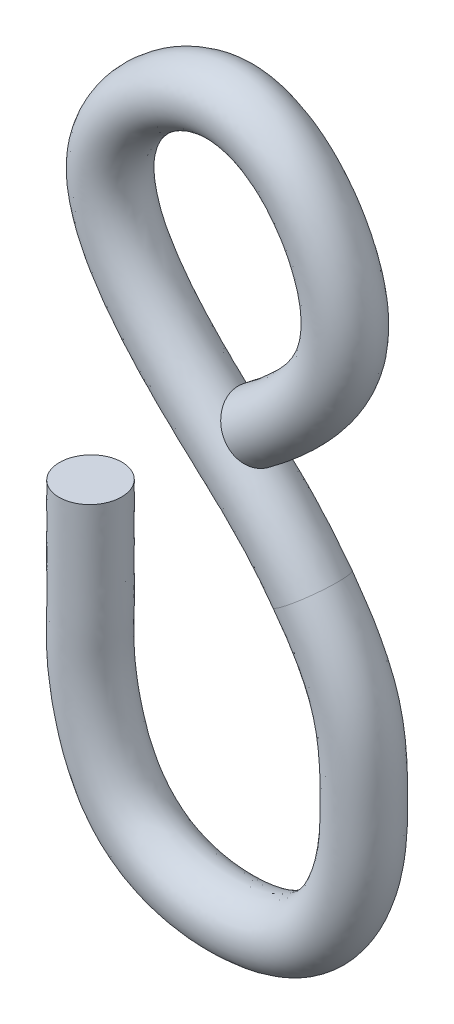
ISO-10303-21;
HEADER;
FILE_DESCRIPTION(('STEP AP214'),'2;1');
FILE_NAME('part.step','',(''),(''),'','','');
FILE_SCHEMA(('AUTOMOTIVE_DESIGN { 1 0 10303 214 1 1 1 1 }'));
ENDSEC;
DATA;
#1=APPLICATION_CONTEXT('core data for automotive mechanical design processes');
#2=APPLICATION_PROTOCOL_DEFINITION('international standard','automotive_design',2000,#1);
#3=PRODUCT_CONTEXT('',#1,'mechanical');
#4=PRODUCT('Part','Part','',(#3));
#5=PRODUCT_RELATED_PRODUCT_CATEGORY('part','',(#4));
#6=PRODUCT_DEFINITION_FORMATION('','',#4);
#7=PRODUCT_DEFINITION_CONTEXT('part definition',#1,'design');
#8=PRODUCT_DEFINITION('design','',#6,#7);
#9=PRODUCT_DEFINITION_SHAPE('','',#8);
#10=(LENGTH_UNIT() NAMED_UNIT(*) SI_UNIT(.MILLI.,.METRE.));
#11=(NAMED_UNIT(*) PLANE_ANGLE_UNIT() SI_UNIT($,.RADIAN.));
#12=(NAMED_UNIT(*) SI_UNIT($,.STERADIAN.) SOLID_ANGLE_UNIT());
#13=UNCERTAINTY_MEASURE_WITH_UNIT(LENGTH_MEASURE(1.E-05),#10,'distance_accuracy_value','');
#14=(GEOMETRIC_REPRESENTATION_CONTEXT(3) GLOBAL_UNCERTAINTY_ASSIGNED_CONTEXT((#13)) GLOBAL_UNIT_ASSIGNED_CONTEXT((#10,
#11,#12)) REPRESENTATION_CONTEXT('',''));
#15=CARTESIAN_POINT('',(0.,0.,0.));
#16=DIRECTION('',(0.,0.,1.));
#17=DIRECTION('',(1.,0.,0.));
#18=AXIS2_PLACEMENT_3D('',#15,#16,#17);
#19=CARTESIAN_POINT('',(-19.05,-6.4168863140052,0.));
#20=DIRECTION('',(0.0164387828036416,-0.99986487408046,0.));
#21=DIRECTION('',(0.99986487408046,0.0164387828036416,0.));
#22=AXIS2_PLACEMENT_3D('',#19,#20,#21);
#23=PLANE('',#22);
#24=CARTESIAN_POINT('',(-19.05,-6.4168863140052,0.));
#25=DIRECTION('',(0.0164387828036416,-0.99986487408046,0.));
#26=DIRECTION('',(0.99986487408046,0.0164387828036416,0.));
#27=AXIS2_PLACEMENT_3D('',#24,#25,#26);
#28=CIRCLE('',#27,4.318);
#29=CARTESIAN_POINT('',(-14.7325834737206,-6.34590364985908,0.));
#30=VERTEX_POINT('',#29);
#31=EDGE_CURVE('E39',#30,#30,#28,.T.);
#32=ORIENTED_EDGE('',*,*,#31,.F.);
#33=EDGE_LOOP('',(#32));
#34=FACE_BOUND('',#33,.T.);
#35=ADVANCED_FACE('F36',(#34),#23,.F.);
#36=CARTESIAN_POINT('',(4.11496441653096,11.733169569429,0.));
#37=DIRECTION('',(-0.802534746488182,-0.596605381034356,0.));
#38=DIRECTION('',(0.596605381034356,-0.802534746488182,0.));
#39=AXIS2_PLACEMENT_3D('',#36,#37,#38);
#40=PLANE('',#39);
#41=CARTESIAN_POINT('',(4.11496441653096,11.733169569429,0.));
#42=DIRECTION('',(0.802534746488182,0.596605381034356,0.));
#43=DIRECTION('',(-0.596605381034356,0.802534746488182,0.));
#44=AXIS2_PLACEMENT_3D('',#41,#42,#43);
#45=CIRCLE('',#44,4.318);
#46=CARTESIAN_POINT('',(6.69110645183731,8.26782453409303,0.));
#47=VERTEX_POINT('',#46);
#48=EDGE_CURVE('E44',#47,#47,#45,.T.);
#49=ORIENTED_EDGE('',*,*,#48,.F.);
#50=EDGE_LOOP('',(#49));
#51=FACE_BOUND('',#50,.T.);
#52=ADVANCED_FACE('F70',(#51),#40,.T.);
#53=CARTESIAN_POINT('',(-14.7325834737206,-6.34590364985908,0.));
#54=CARTESIAN_POINT('',(-14.7254328229671,-6.7808319109972,0.));
#55=CARTESIAN_POINT('',(-14.7241074750267,-7.36549660511291,0.));
#56=CARTESIAN_POINT('',(-14.7252174364728,-8.82670726336239,0.));
#57=CARTESIAN_POINT('',(-14.7280481883105,-9.6937262817303,0.));
#58=CARTESIAN_POINT('',(-14.7367607263986,-12.5357255528229,0.));
#59=CARTESIAN_POINT('',(-14.7428400001958,-14.7518943416169,0.));
#60=CARTESIAN_POINT('',(-14.7270109123728,-17.7590349666467,0.));
#61=CARTESIAN_POINT('',(-14.7180873834829,-18.7001309211865,0.));
#62=CARTESIAN_POINT('',(-14.714141920567,-20.5999160815396,0.));
#63=CARTESIAN_POINT('',(-14.7209877801932,-21.5797898323224,0.));
#64=CARTESIAN_POINT('',(-14.7642585356283,-23.501527991146,0.));
#65=CARTESIAN_POINT('',(-14.7914044263805,-24.4062928172492,0.));
#66=CARTESIAN_POINT('',(-14.7779135963209,-26.2028860802022,0.));
#67=CARTESIAN_POINT('',(-14.7359883656067,-27.0938937894571,0.));
#68=CARTESIAN_POINT('',(-14.428294224436,-30.0208629181334,0.));
#69=CARTESIAN_POINT('',(-13.9942212221248,-32.2002118994148,0.));
#70=CARTESIAN_POINT('',(-12.7077764510078,-36.2389952223302,0.));
#71=CARTESIAN_POINT('',(-11.8441888216928,-38.0967105677315,0.));
#72=CARTESIAN_POINT('',(-10.1511386282284,-40.5173502817308,0.));
#73=CARTESIAN_POINT('',(-9.2818207492585,-41.3766293788584,0.));
#74=CARTESIAN_POINT('',(-7.34235762378109,-42.7824918273544,0.));
#75=CARTESIAN_POINT('',(-6.26756808146904,-43.3266938108804,0.));
#76=CARTESIAN_POINT('',(-2.79424963911756,-44.5386102689522,0.));
#77=CARTESIAN_POINT('',(-0.132856514965718,-44.7595620401585,0.));
#78=CARTESIAN_POINT('',(4.27362198728435,-44.354725550921,0.));
#79=CARTESIAN_POINT('',(5.94231889001343,-43.9145643221827,0.));
#80=CARTESIAN_POINT('',(8.76228712345711,-42.5384016023766,0.));
#81=CARTESIAN_POINT('',(9.9378326974876,-41.6164377140105,0.));
#82=CARTESIAN_POINT('',(12.2150705755318,-38.7133734545041,0.));
#83=CARTESIAN_POINT('',(13.3162869229431,-36.4363567667052,0.));
#84=CARTESIAN_POINT('',(14.2788780980703,-32.745220886058,0.));
#85=CARTESIAN_POINT('',(14.480419538483,-31.4991228328472,0.));
#86=CARTESIAN_POINT('',(14.7056328289962,-28.8167545832706,0.));
#87=CARTESIAN_POINT('',(14.7324396692236,-27.393892951395,0.));
#88=CARTESIAN_POINT('',(14.7311674040191,-23.1105977273629,0.));
#89=CARTESIAN_POINT('',(14.62629555945,-20.5267499394289,0.));
#90=CARTESIAN_POINT('',(13.9820226516246,-17.1515978595451,0.));
#91=CARTESIAN_POINT('',(13.6886558039231,-16.1203405285045,0.));
#92=CARTESIAN_POINT('',(12.8834695158917,-14.0056647434885,0.));
#93=CARTESIAN_POINT('',(12.3789758548303,-12.9418790853601,0.));
#94=CARTESIAN_POINT('',(10.8424179460945,-10.1581617973899,0.));
#95=CARTESIAN_POINT('',(9.6746553102802,-8.4165338483334,0.));
#96=CARTESIAN_POINT('',(8.42173674603075,-6.72896085834348,0.));
#97=CARTESIAN_POINT('',(-14.7325834737206,-6.34590364985908,8.636));
#98=CARTESIAN_POINT('',(-14.7254328229671,-6.7808319109972,8.636));
#99=CARTESIAN_POINT('',(-14.7241074750267,-7.36549660511291,8.636));
#100=CARTESIAN_POINT('',(-14.7252174364728,-8.82670726336239,8.636));
#101=CARTESIAN_POINT('',(-14.7280481883105,-9.6937262817303,8.636));
#102=CARTESIAN_POINT('',(-14.7367607263986,-12.5357255528229,8.636));
#103=CARTESIAN_POINT('',(-14.7428400001958,-14.7518943416169,8.636));
#104=CARTESIAN_POINT('',(-14.7270109123728,-17.7590349666467,8.636));
#105=CARTESIAN_POINT('',(-14.7180873834829,-18.7001309211865,8.636));
#106=CARTESIAN_POINT('',(-14.714141920567,-20.5999160815396,8.636));
#107=CARTESIAN_POINT('',(-14.7209877801932,-21.5797898323224,8.636));
#108=CARTESIAN_POINT('',(-14.7642585356283,-23.501527991146,8.636));
#109=CARTESIAN_POINT('',(-14.7914044263805,-24.4062928172492,8.636));
#110=CARTESIAN_POINT('',(-14.7779135963209,-26.2028860802022,8.636));
#111=CARTESIAN_POINT('',(-14.7359883656067,-27.0938937894571,8.636));
#112=CARTESIAN_POINT('',(-14.428294224436,-30.0208629181334,8.636));
#113=CARTESIAN_POINT('',(-13.9942212221248,-32.2002118994148,8.636));
#114=CARTESIAN_POINT('',(-12.7077764510078,-36.2389952223302,8.636));
#115=CARTESIAN_POINT('',(-11.8441888216928,-38.0967105677315,8.636));
#116=CARTESIAN_POINT('',(-10.1511386282284,-40.5173502817308,8.636));
#117=CARTESIAN_POINT('',(-9.2818207492585,-41.3766293788584,8.636));
#118=CARTESIAN_POINT('',(-7.34235762378109,-42.7824918273544,8.636));
#119=CARTESIAN_POINT('',(-6.26756808146904,-43.3266938108804,8.636));
#120=CARTESIAN_POINT('',(-2.79424963911756,-44.5386102689522,8.636));
#121=CARTESIAN_POINT('',(-0.132856514965718,-44.7595620401585,8.636));
#122=CARTESIAN_POINT('',(4.27362198728435,-44.354725550921,8.636));
#123=CARTESIAN_POINT('',(5.94231889001343,-43.9145643221827,8.636));
#124=CARTESIAN_POINT('',(8.76228712345711,-42.5384016023766,8.636));
#125=CARTESIAN_POINT('',(9.9378326974876,-41.6164377140105,8.636));
#126=CARTESIAN_POINT('',(12.2150705755318,-38.7133734545041,8.636));
#127=CARTESIAN_POINT('',(13.3162869229431,-36.4363567667052,8.636));
#128=CARTESIAN_POINT('',(14.2788780980703,-32.745220886058,8.636));
#129=CARTESIAN_POINT('',(14.480419538483,-31.4991228328472,8.636));
#130=CARTESIAN_POINT('',(14.7056328289962,-28.8167545832706,8.636));
#131=CARTESIAN_POINT('',(14.7324396692236,-27.393892951395,8.636));
#132=CARTESIAN_POINT('',(14.7311674040191,-23.1105977273629,8.636));
#133=CARTESIAN_POINT('',(14.62629555945,-20.5267499394289,8.636));
#134=CARTESIAN_POINT('',(13.9820226516246,-17.1515978595451,8.636));
#135=CARTESIAN_POINT('',(13.6886558039231,-16.1203405285045,8.636));
#136=CARTESIAN_POINT('',(12.8834695158917,-14.0056647434885,8.636));
#137=CARTESIAN_POINT('',(12.3789758548303,-12.9418790853601,8.636));
#138=CARTESIAN_POINT('',(10.8424179460945,-10.1581617973899,8.636));
#139=CARTESIAN_POINT('',(9.6746553102802,-8.4165338483334,8.636));
#140=CARTESIAN_POINT('',(8.42173674603075,-6.72896085834347,8.636));
#141=CARTESIAN_POINT('',(-23.3674165262794,-6.48786897815133,8.636));
#142=CARTESIAN_POINT('',(-23.3622323899889,-6.80318626647926,8.636));
#143=CARTESIAN_POINT('',(-23.3601180643608,-7.37615694591977,8.636));
#144=CARTESIAN_POINT('',(-23.3612018640017,-8.80292680593947,8.636));
#145=CARTESIAN_POINT('',(-23.3640045459515,-9.66625290797423,8.636));
#146=CARTESIAN_POINT('',(-23.3727262685901,-12.511248148196,8.636));
#147=CARTESIAN_POINT('',(-23.3789817837576,-14.7476879967707,8.636));
#148=CARTESIAN_POINT('',(-23.3627688337695,-17.8277530740838,8.636));
#149=CARTESIAN_POINT('',(-23.3539797725524,-18.7609144133306,8.636));
#150=CARTESIAN_POINT('',(-23.3502122838888,-20.5750029114851,8.636));
#151=CARTESIAN_POINT('',(-23.3559036740191,-21.4344287958342,8.636));
#152=CARTESIAN_POINT('',(-23.3969659280282,-23.2580831056167,8.636));
#153=CARTESIAN_POINT('',(-23.42873878553,-24.2610182796444,8.636));
#154=CARTESIAN_POINT('',(-23.4120923011303,-26.477854416802,8.636));
#155=CARTESIAN_POINT('',(-23.3549745919598,-27.7084162950129,8.636));
#156=CARTESIAN_POINT('',(-22.9563426061567,-31.5004401324114,8.636));
#157=CARTESIAN_POINT('',(-22.4216901918861,-34.197054523551,8.636));
#158=CARTESIAN_POINT('',(-20.7376191561368,-39.4841823992839,8.636));
#159=CARTESIAN_POINT('',(-19.5994163949533,-42.0764149014211,8.636));
#160=CARTESIAN_POINT('',(-16.670374952904,-46.2642139702054,8.636));
#161=CARTESIAN_POINT('',(-15.0930938334186,-47.8304099102656,8.636));
#162=CARTESIAN_POINT('',(-11.6680147844855,-50.3131536949401,8.636));
#163=CARTESIAN_POINT('',(-9.82486114152734,-51.2320829038099,8.636));
#164=CARTESIAN_POINT('',(-4.21488165648385,-53.1895269414955,8.636));
#165=CARTESIAN_POINT('',(-0.381451635805625,-53.4547713746269,8.636));
#166=CARTESIAN_POINT('',(5.89750580893666,-52.8779045879972,8.636));
#167=CARTESIAN_POINT('',(8.62122772636509,-52.216706916149,8.636));
#168=CARTESIAN_POINT('',(13.6583587513814,-49.7585544239032,8.636));
#169=CARTESIAN_POINT('',(15.9474936216516,-47.9475620036466,8.636));
#170=CARTESIAN_POINT('',(19.9137526243296,-42.8913029086174,8.636));
#171=CARTESIAN_POINT('',(21.408836907548,-39.6278077216711,8.636));
#172=CARTESIAN_POINT('',(22.7673775228971,-34.4183707980143,8.636));
#173=CARTESIAN_POINT('',(23.0537740314502,-32.6071577559427,8.636));
#174=CARTESIAN_POINT('',(23.3437198353995,-29.1538028805282,8.636));
#175=CARTESIAN_POINT('',(23.3684686397601,-27.4901446784797,8.636));
#176=CARTESIAN_POINT('',(23.367111403686,-22.920780391519,8.636));
#177=CARTESIAN_POINT('',(23.2818743289537,-19.8124415539441,8.636));
#178=CARTESIAN_POINT('',(22.3784850755113,-15.0798568486278,8.636));
#179=CARTESIAN_POINT('',(21.9272666805951,-13.4881704181846,8.636));
#180=CARTESIAN_POINT('',(20.786357694246,-10.4917798380616,8.636));
#181=CARTESIAN_POINT('',(20.1016960911846,-9.06211887070707,8.636));
#182=CARTESIAN_POINT('',(18.1492904806054,-5.52502780277858,8.636));
#183=CARTESIAN_POINT('',(16.7696020713235,-3.48330219517623,8.636));
#184=CARTESIAN_POINT('',(15.3544200788655,-1.57902033701783,8.636));
#185=CARTESIAN_POINT('',(-23.3674165262794,-6.48786897815133,0.));
#186=CARTESIAN_POINT('',(-23.3622323899889,-6.80318626647925,0.));
#187=CARTESIAN_POINT('',(-23.3601180643608,-7.37615694591977,0.));
#188=CARTESIAN_POINT('',(-23.3612018640017,-8.80292680593947,0.));
#189=CARTESIAN_POINT('',(-23.3640045459515,-9.66625290797423,0.));
#190=CARTESIAN_POINT('',(-23.3727262685901,-12.511248148196,0.));
#191=CARTESIAN_POINT('',(-23.3789817837576,-14.7476879967707,0.));
#192=CARTESIAN_POINT('',(-23.3627688337695,-17.8277530740838,0.));
#193=CARTESIAN_POINT('',(-23.3539797725524,-18.7609144133306,0.));
#194=CARTESIAN_POINT('',(-23.3502122838888,-20.5750029114851,0.));
#195=CARTESIAN_POINT('',(-23.3559036740191,-21.4344287958342,0.));
#196=CARTESIAN_POINT('',(-23.3969659280282,-23.2580831056167,0.));
#197=CARTESIAN_POINT('',(-23.42873878553,-24.2610182796444,0.));
#198=CARTESIAN_POINT('',(-23.4120923011303,-26.477854416802,0.));
#199=CARTESIAN_POINT('',(-23.3549745919598,-27.7084162950129,0.));
#200=CARTESIAN_POINT('',(-22.9563426061567,-31.5004401324114,0.));
#201=CARTESIAN_POINT('',(-22.4216901918861,-34.197054523551,0.));
#202=CARTESIAN_POINT('',(-20.7376191561368,-39.4841823992839,0.));
#203=CARTESIAN_POINT('',(-19.5994163949533,-42.0764149014211,0.));
#204=CARTESIAN_POINT('',(-16.670374952904,-46.2642139702054,0.));
#205=CARTESIAN_POINT('',(-15.0930938334186,-47.8304099102656,0.));
#206=CARTESIAN_POINT('',(-11.6680147844855,-50.3131536949401,0.));
#207=CARTESIAN_POINT('',(-9.82486114152734,-51.2320829038099,0.));
#208=CARTESIAN_POINT('',(-4.21488165648385,-53.1895269414955,0.));
#209=CARTESIAN_POINT('',(-0.381451635805625,-53.4547713746269,0.));
#210=CARTESIAN_POINT('',(5.89750580893666,-52.8779045879972,0.));
#211=CARTESIAN_POINT('',(8.62122772636509,-52.216706916149,0.));
#212=CARTESIAN_POINT('',(13.6583587513814,-49.7585544239032,0.));
#213=CARTESIAN_POINT('',(15.9474936216516,-47.9475620036466,0.));
#214=CARTESIAN_POINT('',(19.9137526243296,-42.8913029086174,0.));
#215=CARTESIAN_POINT('',(21.408836907548,-39.6278077216711,0.));
#216=CARTESIAN_POINT('',(22.7673775228971,-34.4183707980143,0.));
#217=CARTESIAN_POINT('',(23.0537740314502,-32.6071577559427,0.));
#218=CARTESIAN_POINT('',(23.3437198353995,-29.1538028805282,0.));
#219=CARTESIAN_POINT('',(23.3684686397601,-27.4901446784797,0.));
#220=CARTESIAN_POINT('',(23.367111403686,-22.920780391519,0.));
#221=CARTESIAN_POINT('',(23.2818743289537,-19.8124415539441,0.));
#222=CARTESIAN_POINT('',(22.3784850755113,-15.0798568486278,0.));
#223=CARTESIAN_POINT('',(21.9272666805951,-13.4881704181846,0.));
#224=CARTESIAN_POINT('',(20.786357694246,-10.4917798380616,0.));
#225=CARTESIAN_POINT('',(20.1016960911846,-9.06211887070707,0.));
#226=CARTESIAN_POINT('',(18.1492904806054,-5.52502780277858,0.));
#227=CARTESIAN_POINT('',(16.7696020713235,-3.48330219517623,0.));
#228=CARTESIAN_POINT('',(15.3544200788655,-1.57902033701783,0.));
#229=CARTESIAN_POINT('',(-23.3674165262794,-6.48786897815133,-8.636));
#230=CARTESIAN_POINT('',(-23.3622323899889,-6.80318626647926,-8.636));
#231=CARTESIAN_POINT('',(-23.3601180643608,-7.37615694591977,-8.636));
#232=CARTESIAN_POINT('',(-23.3612018640017,-8.80292680593947,-8.636));
#233=CARTESIAN_POINT('',(-23.3640045459515,-9.66625290797423,-8.636));
#234=CARTESIAN_POINT('',(-23.3727262685901,-12.511248148196,-8.636));
#235=CARTESIAN_POINT('',(-23.3789817837576,-14.7476879967707,-8.636));
#236=CARTESIAN_POINT('',(-23.3627688337695,-17.8277530740838,-8.636));
#237=CARTESIAN_POINT('',(-23.3539797725524,-18.7609144133306,-8.636));
#238=CARTESIAN_POINT('',(-23.3502122838888,-20.5750029114851,-8.636));
#239=CARTESIAN_POINT('',(-23.3559036740191,-21.4344287958342,-8.636));
#240=CARTESIAN_POINT('',(-23.3969659280282,-23.2580831056167,-8.636));
#241=CARTESIAN_POINT('',(-23.42873878553,-24.2610182796444,-8.636));
#242=CARTESIAN_POINT('',(-23.4120923011303,-26.477854416802,-8.636));
#243=CARTESIAN_POINT('',(-23.3549745919598,-27.7084162950129,-8.636));
#244=CARTESIAN_POINT('',(-22.9563426061567,-31.5004401324114,-8.636));
#245=CARTESIAN_POINT('',(-22.4216901918861,-34.197054523551,-8.636));
#246=CARTESIAN_POINT('',(-20.7376191561368,-39.4841823992839,-8.636));
#247=CARTESIAN_POINT('',(-19.5994163949533,-42.0764149014211,-8.636));
#248=CARTESIAN_POINT('',(-16.670374952904,-46.2642139702054,-8.636));
#249=CARTESIAN_POINT('',(-15.0930938334186,-47.8304099102656,-8.636));
#250=CARTESIAN_POINT('',(-11.6680147844855,-50.3131536949401,-8.636));
#251=CARTESIAN_POINT('',(-9.82486114152734,-51.2320829038099,-8.636));
#252=CARTESIAN_POINT('',(-4.21488165648385,-53.1895269414955,-8.636));
#253=CARTESIAN_POINT('',(-0.381451635805625,-53.4547713746269,-8.636));
#254=CARTESIAN_POINT('',(5.89750580893666,-52.8779045879972,-8.636));
#255=CARTESIAN_POINT('',(8.62122772636509,-52.216706916149,-8.636));
#256=CARTESIAN_POINT('',(13.6583587513814,-49.7585544239032,-8.636));
#257=CARTESIAN_POINT('',(15.9474936216516,-47.9475620036466,-8.636));
#258=CARTESIAN_POINT('',(19.9137526243296,-42.8913029086174,-8.636));
#259=CARTESIAN_POINT('',(21.408836907548,-39.6278077216711,-8.636));
#260=CARTESIAN_POINT('',(22.7673775228971,-34.4183707980143,-8.636));
#261=CARTESIAN_POINT('',(23.0537740314502,-32.6071577559427,-8.636));
#262=CARTESIAN_POINT('',(23.3437198353995,-29.1538028805282,-8.636));
#263=CARTESIAN_POINT('',(23.3684686397601,-27.4901446784797,-8.636));
#264=CARTESIAN_POINT('',(23.367111403686,-22.920780391519,-8.636));
#265=CARTESIAN_POINT('',(23.2818743289537,-19.8124415539441,-8.636));
#266=CARTESIAN_POINT('',(22.3784850755113,-15.0798568486278,-8.636));
#267=CARTESIAN_POINT('',(21.9272666805951,-13.4881704181846,-8.636));
#268=CARTESIAN_POINT('',(20.786357694246,-10.4917798380616,-8.636));
#269=CARTESIAN_POINT('',(20.1016960911846,-9.06211887070707,-8.636));
#270=CARTESIAN_POINT('',(18.1492904806054,-5.52502780277858,-8.636));
#271=CARTESIAN_POINT('',(16.7696020713235,-3.48330219517623,-8.636));
#272=CARTESIAN_POINT('',(15.3544200788655,-1.57902033701783,-8.636));
#273=CARTESIAN_POINT('',(-14.7325834737206,-6.34590364985908,-8.636));
#274=CARTESIAN_POINT('',(-14.7254328229671,-6.7808319109972,-8.636));
#275=CARTESIAN_POINT('',(-14.7241074750267,-7.36549660511291,-8.636));
#276=CARTESIAN_POINT('',(-14.7252174364728,-8.82670726336239,-8.636));
#277=CARTESIAN_POINT('',(-14.7280481883105,-9.6937262817303,-8.636));
#278=CARTESIAN_POINT('',(-14.7367607263986,-12.5357255528229,-8.636));
#279=CARTESIAN_POINT('',(-14.7428400001958,-14.7518943416169,-8.636));
#280=CARTESIAN_POINT('',(-14.7270109123728,-17.7590349666467,-8.636));
#281=CARTESIAN_POINT('',(-14.7180873834829,-18.7001309211865,-8.636));
#282=CARTESIAN_POINT('',(-14.714141920567,-20.5999160815396,-8.636));
#283=CARTESIAN_POINT('',(-14.7209877801932,-21.5797898323224,-8.636));
#284=CARTESIAN_POINT('',(-14.7642585356283,-23.501527991146,-8.636));
#285=CARTESIAN_POINT('',(-14.7914044263805,-24.4062928172492,-8.636));
#286=CARTESIAN_POINT('',(-14.7779135963209,-26.2028860802022,-8.636));
#287=CARTESIAN_POINT('',(-14.7359883656067,-27.0938937894571,-8.636));
#288=CARTESIAN_POINT('',(-14.428294224436,-30.0208629181334,-8.636));
#289=CARTESIAN_POINT('',(-13.9942212221248,-32.2002118994148,-8.636));
#290=CARTESIAN_POINT('',(-12.7077764510078,-36.2389952223302,-8.636));
#291=CARTESIAN_POINT('',(-11.8441888216928,-38.0967105677315,-8.636));
#292=CARTESIAN_POINT('',(-10.1511386282284,-40.5173502817308,-8.636));
#293=CARTESIAN_POINT('',(-9.2818207492585,-41.3766293788584,-8.636));
#294=CARTESIAN_POINT('',(-7.34235762378109,-42.7824918273544,-8.636));
#295=CARTESIAN_POINT('',(-6.26756808146904,-43.3266938108804,-8.636));
#296=CARTESIAN_POINT('',(-2.79424963911756,-44.5386102689522,-8.636));
#297=CARTESIAN_POINT('',(-0.132856514965718,-44.7595620401585,-8.636));
#298=CARTESIAN_POINT('',(4.27362198728435,-44.354725550921,-8.636));
#299=CARTESIAN_POINT('',(5.94231889001343,-43.9145643221827,-8.636));
#300=CARTESIAN_POINT('',(8.76228712345711,-42.5384016023766,-8.636));
#301=CARTESIAN_POINT('',(9.9378326974876,-41.6164377140105,-8.636));
#302=CARTESIAN_POINT('',(12.2150705755318,-38.7133734545041,-8.636));
#303=CARTESIAN_POINT('',(13.3162869229431,-36.4363567667052,-8.636));
#304=CARTESIAN_POINT('',(14.2788780980703,-32.745220886058,-8.636));
#305=CARTESIAN_POINT('',(14.480419538483,-31.4991228328472,-8.636));
#306=CARTESIAN_POINT('',(14.7056328289962,-28.8167545832706,-8.636));
#307=CARTESIAN_POINT('',(14.7324396692236,-27.393892951395,-8.636));
#308=CARTESIAN_POINT('',(14.7311674040191,-23.1105977273629,-8.636));
#309=CARTESIAN_POINT('',(14.62629555945,-20.5267499394289,-8.636));
#310=CARTESIAN_POINT('',(13.9820226516246,-17.1515978595451,-8.636));
#311=CARTESIAN_POINT('',(13.6886558039231,-16.1203405285045,-8.636));
#312=CARTESIAN_POINT('',(12.8834695158917,-14.0056647434885,-8.636));
#313=CARTESIAN_POINT('',(12.3789758548303,-12.9418790853601,-8.636));
#314=CARTESIAN_POINT('',(10.8424179460945,-10.1581617973899,-8.636));
#315=CARTESIAN_POINT('',(9.6746553102802,-8.4165338483334,-8.636));
#316=CARTESIAN_POINT('',(8.42173674603075,-6.72896085834347,-8.636));
#317=CARTESIAN_POINT('',(-14.7325834737206,-6.34590364985908,0.));
#318=CARTESIAN_POINT('',(-14.7254328229671,-6.7808319109972,0.));
#319=CARTESIAN_POINT('',(-14.7241074750267,-7.36549660511291,0.));
#320=CARTESIAN_POINT('',(-14.7252174364728,-8.82670726336239,0.));
#321=CARTESIAN_POINT('',(-14.7280481883105,-9.6937262817303,0.));
#322=CARTESIAN_POINT('',(-14.7367607263986,-12.5357255528229,0.));
#323=CARTESIAN_POINT('',(-14.7428400001958,-14.7518943416169,0.));
#324=CARTESIAN_POINT('',(-14.7270109123728,-17.7590349666467,0.));
#325=CARTESIAN_POINT('',(-14.7180873834829,-18.7001309211865,0.));
#326=CARTESIAN_POINT('',(-14.714141920567,-20.5999160815396,0.));
#327=CARTESIAN_POINT('',(-14.7209877801932,-21.5797898323224,0.));
#328=CARTESIAN_POINT('',(-14.7642585356283,-23.501527991146,0.));
#329=CARTESIAN_POINT('',(-14.7914044263805,-24.4062928172492,0.));
#330=CARTESIAN_POINT('',(-14.7779135963209,-26.2028860802022,0.));
#331=CARTESIAN_POINT('',(-14.7359883656067,-27.0938937894571,0.));
#332=CARTESIAN_POINT('',(-14.428294224436,-30.0208629181334,0.));
#333=CARTESIAN_POINT('',(-13.9942212221248,-32.2002118994148,0.));
#334=CARTESIAN_POINT('',(-12.7077764510078,-36.2389952223302,0.));
#335=CARTESIAN_POINT('',(-11.8441888216928,-38.0967105677315,0.));
#336=CARTESIAN_POINT('',(-10.1511386282284,-40.5173502817308,0.));
#337=CARTESIAN_POINT('',(-9.2818207492585,-41.3766293788584,0.));
#338=CARTESIAN_POINT('',(-7.34235762378109,-42.7824918273544,0.));
#339=CARTESIAN_POINT('',(-6.26756808146904,-43.3266938108804,0.));
#340=CARTESIAN_POINT('',(-2.79424963911756,-44.5386102689522,0.));
#341=CARTESIAN_POINT('',(-0.132856514965718,-44.7595620401585,0.));
#342=CARTESIAN_POINT('',(4.27362198728435,-44.354725550921,0.));
#343=CARTESIAN_POINT('',(5.94231889001343,-43.9145643221827,0.));
#344=CARTESIAN_POINT('',(8.76228712345711,-42.5384016023766,0.));
#345=CARTESIAN_POINT('',(9.9378326974876,-41.6164377140105,0.));
#346=CARTESIAN_POINT('',(12.2150705755318,-38.7133734545041,0.));
#347=CARTESIAN_POINT('',(13.3162869229431,-36.4363567667052,0.));
#348=CARTESIAN_POINT('',(14.2788780980703,-32.745220886058,0.));
#349=CARTESIAN_POINT('',(14.480419538483,-31.4991228328472,0.));
#350=CARTESIAN_POINT('',(14.7056328289962,-28.8167545832706,0.));
#351=CARTESIAN_POINT('',(14.7324396692236,-27.393892951395,0.));
#352=CARTESIAN_POINT('',(14.7311674040191,-23.1105977273629,0.));
#353=CARTESIAN_POINT('',(14.62629555945,-20.5267499394289,0.));
#354=CARTESIAN_POINT('',(13.9820226516246,-17.1515978595451,0.));
#355=CARTESIAN_POINT('',(13.6886558039231,-16.1203405285045,0.));
#356=CARTESIAN_POINT('',(12.8834695158917,-14.0056647434885,0.));
#357=CARTESIAN_POINT('',(12.3789758548303,-12.9418790853601,0.));
#358=CARTESIAN_POINT('',(10.8424179460945,-10.1581617973899,0.));
#359=CARTESIAN_POINT('',(9.6746553102802,-8.4165338483334,0.));
#360=CARTESIAN_POINT('',(8.42173674603075,-6.72896085834348,0.));
#361=(BOUNDED_SURFACE() B_SPLINE_SURFACE(3,3,((#53,#54,#55,#56,#57,#58,#59,#60,#61,#62,#63,#64,
#65,#66,#67,#68,#69,#70,#71,#72,#73,#74,#75,#76,#77,#78,#79,#80,#81,#82,#83,#84,#85,#86,#87,#88,
#89,#90,#91,#92,#93,#94,#95,#96),(#97,#98,#99,#100,#101,#102,#103,#104,#105,#106,#107,#108,#109,
#110,#111,#112,#113,#114,#115,#116,#117,#118,#119,#120,#121,#122,#123,#124,#125,#126,#127,#128,
#129,#130,#131,#132,#133,#134,#135,#136,#137,#138,#139,#140),(#141,#142,#143,#144,#145,#146,
#147,#148,#149,#150,#151,#152,#153,#154,#155,#156,#157,#158,#159,#160,#161,#162,#163,#164,#165,
#166,#167,#168,#169,#170,#171,#172,#173,#174,#175,#176,#177,#178,#179,#180,#181,#182,#183,#184),
(#185,#186,#187,#188,#189,#190,#191,#192,#193,#194,#195,#196,#197,#198,#199,#200,#201,#202,#203,
#204,#205,#206,#207,#208,#209,#210,#211,#212,#213,#214,#215,#216,#217,#218,#219,#220,#221,#222,
#223,#224,#225,#226,#227,#228),(#229,#230,#231,#232,#233,#234,#235,#236,#237,#238,#239,#240,
#241,#242,#243,#244,#245,#246,#247,#248,#249,#250,#251,#252,#253,#254,#255,#256,#257,#258,#259,
#260,#261,#262,#263,#264,#265,#266,#267,#268,#269,#270,#271,#272),(#273,#274,#275,#276,#277,
#278,#279,#280,#281,#282,#283,#284,#285,#286,#287,#288,#289,#290,#291,#292,#293,#294,#295,#296,
#297,#298,#299,#300,#301,#302,#303,#304,#305,#306,#307,#308,#309,#310,#311,#312,#313,#314,#315,
#316),(#317,#318,#319,#320,#321,#322,#323,#324,#325,#326,#327,#328,#329,#330,#331,#332,#333,
#334,#335,#336,#337,#338,#339,#340,#341,#342,#343,#344,#345,#346,#347,#348,#349,#350,#351,#352,
#353,#354,#355,#356,#357,#358,#359,#360)),.UNSPECIFIED.,.T.,.F.,
.F.) B_SPLINE_SURFACE_WITH_KNOTS((4,3,4),(4,2,2,2,2,2,2,2,2,2,2,2,2,2,2,2,2,2,2,2,2,4),(0.,0.5,
1.),(0.,0.0128100804666204,0.0256201609332409,0.0512403218664817,0.0632395492977895,
0.0752387767290972,0.0872380041604049,0.0992372315917127,0.123235686454328,0.147234141316944,
0.166957580059712,0.186681018802481,0.226127896288019,0.257793610437338,0.289459324586657,
0.325905687138726,0.34412886841476,0.362352049690794,0.396883910282004,0.414149840577608,
0.431415770873213,0.458456693756576),
.UNSPECIFIED.) GEOMETRIC_REPRESENTATION_ITEM() RATIONAL_B_SPLINE_SURFACE(((1.,1.,1.,1.,1.,1.,1.,
1.,1.,1.,1.,1.,1.,1.,1.,1.,1.,1.,1.,1.,1.,1.,1.,1.,1.,1.,1.,1.,1.,1.,1.,1.,1.,1.,1.,1.,1.,1.,1.,
1.,1.,1.,1.,1.),(0.333333333333333,0.333333333333333,0.333333333333333,0.333333333333333,
0.333333333333333,0.333333333333333,0.333333333333333,0.333333333333333,0.333333333333333,
0.333333333333333,0.333333333333333,0.333333333333333,0.333333333333333,0.333333333333333,
0.333333333333333,0.333333333333333,0.333333333333333,0.333333333333333,0.333333333333333,
0.333333333333333,0.333333333333333,0.333333333333333,0.333333333333333,0.333333333333333,
0.333333333333333,0.333333333333333,0.333333333333333,0.333333333333333,0.333333333333333,
0.333333333333333,0.333333333333333,0.333333333333333,0.333333333333333,0.333333333333333,
0.333333333333333,0.333333333333333,0.333333333333333,0.333333333333333,0.333333333333333,
0.333333333333333,0.333333333333333,0.333333333333333,0.333333333333333,0.333333333333333),
(0.333333333333333,0.333333333333333,0.333333333333333,0.333333333333333,0.333333333333333,
0.333333333333333,0.333333333333333,0.333333333333333,0.333333333333333,0.333333333333333,
0.333333333333333,0.333333333333333,0.333333333333333,0.333333333333333,0.333333333333333,
0.333333333333333,0.333333333333333,0.333333333333333,0.333333333333333,0.333333333333333,
0.333333333333333,0.333333333333333,0.333333333333333,0.333333333333333,0.333333333333333,
0.333333333333333,0.333333333333333,0.333333333333333,0.333333333333333,0.333333333333333,
0.333333333333333,0.333333333333333,0.333333333333333,0.333333333333333,0.333333333333333,
0.333333333333333,0.333333333333333,0.333333333333333,0.333333333333333,0.333333333333333,
0.333333333333333,0.333333333333333,0.333333333333333,0.333333333333333),(1.,1.,1.,1.,1.,1.,1.,
1.,1.,1.,1.,1.,1.,1.,1.,1.,1.,1.,1.,1.,1.,1.,1.,1.,1.,1.,1.,1.,1.,1.,1.,1.,1.,1.,1.,1.,1.,1.,1.,
1.,1.,1.,1.,1.),(0.333333333333333,0.333333333333333,0.333333333333333,0.333333333333333,
0.333333333333333,0.333333333333333,0.333333333333333,0.333333333333333,0.333333333333333,
0.333333333333333,0.333333333333333,0.333333333333333,0.333333333333333,0.333333333333333,
0.333333333333333,0.333333333333333,0.333333333333333,0.333333333333333,0.333333333333333,
0.333333333333333,0.333333333333333,0.333333333333333,0.333333333333333,0.333333333333333,
0.333333333333333,0.333333333333333,0.333333333333333,0.333333333333333,0.333333333333333,
0.333333333333333,0.333333333333333,0.333333333333333,0.333333333333333,0.333333333333333,
0.333333333333333,0.333333333333333,0.333333333333333,0.333333333333333,0.333333333333333,
0.333333333333333,0.333333333333333,0.333333333333333,0.333333333333333,0.333333333333333),
(0.333333333333333,0.333333333333333,0.333333333333333,0.333333333333333,0.333333333333333,
0.333333333333333,0.333333333333333,0.333333333333333,0.333333333333333,0.333333333333333,
0.333333333333333,0.333333333333333,0.333333333333333,0.333333333333333,0.333333333333333,
0.333333333333333,0.333333333333333,0.333333333333333,0.333333333333333,0.333333333333333,
0.333333333333333,0.333333333333333,0.333333333333333,0.333333333333333,0.333333333333333,
0.333333333333333,0.333333333333333,0.333333333333333,0.333333333333333,0.333333333333333,
0.333333333333333,0.333333333333333,0.333333333333333,0.333333333333333,0.333333333333333,
0.333333333333333,0.333333333333333,0.333333333333333,0.333333333333333,0.333333333333333,
0.333333333333333,0.333333333333333,0.333333333333333,0.333333333333333),(1.,1.,1.,1.,1.,1.,1.,
1.,1.,1.,1.,1.,1.,1.,1.,1.,1.,1.,1.,1.,1.,1.,1.,1.,1.,1.,1.,1.,1.,1.,1.,1.,1.,1.,1.,1.,1.,1.,1.,
1.,1.,1.,1.,1.))) REPRESENTATION_ITEM('') SURFACE());
#362=CARTESIAN_POINT('',(8.42173674603075,-6.72896085834348,0.));
#363=CARTESIAN_POINT('',(8.42173674603075,-6.72896085834347,8.636));
#364=CARTESIAN_POINT('',(15.3544200788655,-1.57902033701783,8.636));
#365=CARTESIAN_POINT('',(15.3544200788655,-1.57902033701783,0.));
#366=CARTESIAN_POINT('',(15.3544200788655,-1.57902033701783,-8.636));
#367=CARTESIAN_POINT('',(8.42173674603075,-6.72896085834347,-8.636));
#368=CARTESIAN_POINT('',(8.42173674603075,-6.72896085834348,0.));
#369=(BOUNDED_CURVE() B_SPLINE_CURVE(3,(#362,#363,#364,#365,#366,#367,#368),.UNSPECIFIED.,.T.,
.F.) B_SPLINE_CURVE_WITH_KNOTS((4,3,4),(0.,0.5,1.),
.UNSPECIFIED.) CURVE() GEOMETRIC_REPRESENTATION_ITEM() RATIONAL_B_SPLINE_CURVE((1.,
0.333333333333333,0.333333333333333,1.,0.333333333333333,0.333333333333333,1.)) REPRESENTATION_ITEM(''));
#370=CARTESIAN_POINT('',(8.42173674603075,-6.72896085834348,0.));
#371=VERTEX_POINT('',#370);
#372=EDGE_CURVE('E11',#371,#371,#369,.T.);
#373=ORIENTED_EDGE('',*,*,#31,.T.);
#374=EDGE_LOOP('',(#373));
#375=FACE_BOUND('',#374,.T.);
#376=ORIENTED_EDGE('',*,*,#372,.F.);
#377=EDGE_LOOP('',(#376));
#378=FACE_BOUND('',#377,.T.);
#379=ADVANCED_FACE('F57',(#375,#378),#361,.T.);
#380=CARTESIAN_POINT('',(8.42173674603075,-6.72896085834348,0.));
#381=CARTESIAN_POINT('',(3.40334543842582,0.0303783880882784,0.));
#382=CARTESIAN_POINT('',(-3.31774508851049,4.55639004927983,0.));
#383=CARTESIAN_POINT('',(-30.7177837702507,34.1684686568207,0.));
#384=CARTESIAN_POINT('',(2.76594421014149,63.585373126736,0.));
#385=CARTESIAN_POINT('',(27.4886161571609,30.9413389290147,0.));
#386=CARTESIAN_POINT('',(16.1806674063054,15.3223765677429,0.));
#387=CARTESIAN_POINT('',(6.69110645183731,8.26782453409303,0.));
#388=CARTESIAN_POINT('',(8.42173674603075,-6.72896085834347,8.636));
#389=CARTESIAN_POINT('',(3.40334543842579,0.0303783880883089,8.636));
#390=CARTESIAN_POINT('',(-3.31774508851047,4.55639004927982,8.636));
#391=CARTESIAN_POINT('',(-30.7177837702507,34.1684686568207,8.636));
#392=CARTESIAN_POINT('',(2.76594421014149,63.585373126736,8.636));
#393=CARTESIAN_POINT('',(27.4886161571609,30.9413389290147,8.636));
#394=CARTESIAN_POINT('',(16.1806674063054,15.3223765677429,8.636));
#395=CARTESIAN_POINT('',(6.69110645183731,8.26782453409303,8.636));
#396=CARTESIAN_POINT('',(15.3544200788655,-1.57902033701783,8.636));
#397=CARTESIAN_POINT('',(9.68610514421962,6.04831618499825,8.636));
#398=CARTESIAN_POINT('',(-0.67675951599911,13.9343709119934,8.636));
#399=CARTESIAN_POINT('',(-18.2547405613214,33.7581574601379,8.636));
#400=CARTESIAN_POINT('',(1.81779194716166,50.6712880224297,8.636));
#401=CARTESIAN_POINT('',(15.6742486074288,31.2796363673615,8.636));
#402=CARTESIAN_POINT('',(9.87725096834957,21.3973133314328,8.636));
#403=CARTESIAN_POINT('',(1.53882238122462,15.198514604765,8.636));
#404=CARTESIAN_POINT('',(15.3544200788655,-1.57902033701783,0.));
#405=CARTESIAN_POINT('',(9.68610514421965,6.04831618499826,0.));
#406=CARTESIAN_POINT('',(-0.676759515999123,13.9343709119934,0.));
#407=CARTESIAN_POINT('',(-18.2547405613214,33.7581574601379,0.));
#408=CARTESIAN_POINT('',(1.81779194716166,50.6712880224297,0.));
#409=CARTESIAN_POINT('',(15.6742486074288,31.2796363673615,0.));
#410=CARTESIAN_POINT('',(9.87725096834957,21.3973133314328,0.));
#411=CARTESIAN_POINT('',(1.53882238122462,15.198514604765,0.));
#412=CARTESIAN_POINT('',(15.3544200788655,-1.57902033701783,-8.636));
#413=CARTESIAN_POINT('',(9.68610514421962,6.04831618499825,-8.636));
#414=CARTESIAN_POINT('',(-0.67675951599911,13.9343709119934,-8.636));
#415=CARTESIAN_POINT('',(-18.2547405613214,33.7581574601379,-8.636));
#416=CARTESIAN_POINT('',(1.81779194716166,50.6712880224297,-8.636));
#417=CARTESIAN_POINT('',(15.6742486074288,31.2796363673615,-8.636));
#418=CARTESIAN_POINT('',(9.87725096834957,21.3973133314328,-8.636));
#419=CARTESIAN_POINT('',(1.53882238122462,15.198514604765,-8.636));
#420=CARTESIAN_POINT('',(8.42173674603075,-6.72896085834347,-8.636));
#421=CARTESIAN_POINT('',(3.40334543842579,0.0303783880883089,-8.636));
#422=CARTESIAN_POINT('',(-3.31774508851047,4.55639004927982,-8.636));
#423=CARTESIAN_POINT('',(-30.7177837702507,34.1684686568207,-8.636));
#424=CARTESIAN_POINT('',(2.76594421014149,63.585373126736,-8.636));
#425=CARTESIAN_POINT('',(27.4886161571609,30.9413389290147,-8.636));
#426=CARTESIAN_POINT('',(16.1806674063054,15.3223765677429,-8.636));
#427=CARTESIAN_POINT('',(6.69110645183731,8.26782453409303,-8.636));
#428=CARTESIAN_POINT('',(8.42173674603075,-6.72896085834348,0.));
#429=CARTESIAN_POINT('',(3.40334543842582,0.0303783880882784,0.));
#430=CARTESIAN_POINT('',(-3.31774508851049,4.55639004927983,0.));
#431=CARTESIAN_POINT('',(-30.7177837702507,34.1684686568207,0.));
#432=CARTESIAN_POINT('',(2.76594421014149,63.585373126736,0.));
#433=CARTESIAN_POINT('',(27.4886161571609,30.9413389290147,0.));
#434=CARTESIAN_POINT('',(16.1806674063054,15.3223765677429,0.));
#435=CARTESIAN_POINT('',(6.69110645183731,8.26782453409303,0.));
#436=(BOUNDED_SURFACE() B_SPLINE_SURFACE(3,3,((#380,#381,#382,#383,#384,#385,#386,#387),(#388,
#389,#390,#391,#392,#393,#394,#395),(#396,#397,#398,#399,#400,#401,#402,#403),(#404,#405,#406,
#407,#408,#409,#410,#411),(#412,#413,#414,#415,#416,#417,#418,#419),(#420,#421,#422,#423,#424,
#425,#426,#427),(#428,#429,#430,#431,#432,#433,#434,#435)),.UNSPECIFIED.,.T.,.F.,
.F.) B_SPLINE_SURFACE_WITH_KNOTS((4,3,4),(4,1,1,1,1,4),(0.,0.5,1.),(0.458456693756576,
0.566765355005261,0.675074016253945,0.78338267750263,0.891691338751315,1.),
.UNSPECIFIED.) GEOMETRIC_REPRESENTATION_ITEM() RATIONAL_B_SPLINE_SURFACE(((1.,1.,1.,
0.999999999999999,1.,1.,1.,1.),(0.333333333333333,0.333333333333333,0.333333333333334,
0.333333333333333,0.333333333333333,0.333333333333333,0.333333333333333,0.333333333333333),
(0.333333333333333,0.333333333333333,0.333333333333334,0.333333333333333,0.333333333333333,
0.333333333333333,0.333333333333333,0.333333333333333),(1.,1.,1.,0.999999999999999,1.,1.,1.,1.),
(0.333333333333333,0.333333333333333,0.333333333333334,0.333333333333333,0.333333333333333,
0.333333333333333,0.333333333333333,0.333333333333333),(0.333333333333333,0.333333333333333,
0.333333333333334,0.333333333333333,0.333333333333333,0.333333333333333,0.333333333333333,
0.333333333333333),(1.,1.,1.,0.999999999999999,1.,1.,1.,1.))) REPRESENTATION_ITEM('') SURFACE());
#437=ORIENTED_EDGE('',*,*,#372,.T.);
#438=EDGE_LOOP('',(#437));
#439=FACE_BOUND('',#438,.T.);
#440=ORIENTED_EDGE('',*,*,#48,.T.);
#441=EDGE_LOOP('',(#440));
#442=FACE_BOUND('',#441,.T.);
#443=ADVANCED_FACE('F59',(#439,#442),#436,.T.);
#444=CLOSED_SHELL('',(#35,#52,#379,#443));
#445=MANIFOLD_SOLID_BREP('B2',#444);
#446=ADVANCED_BREP_SHAPE_REPRESENTATION('',(#18,#445),#14);
#447=SHAPE_DEFINITION_REPRESENTATION(#9,#446);
ENDSEC;
END-ISO-10303-21;
